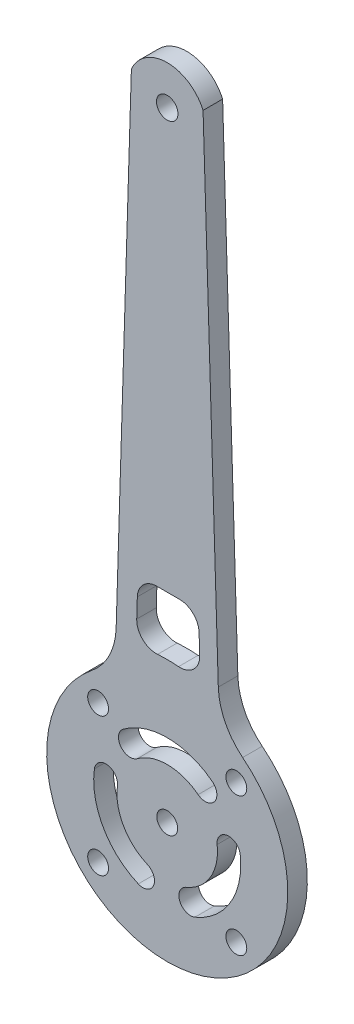
ISO-10303-21;
HEADER;
FILE_DESCRIPTION(('STEP AP214'),'2;1');
FILE_NAME('part.step','',(''),(''),'','','');
FILE_SCHEMA(('AUTOMOTIVE_DESIGN { 1 0 10303 214 1 1 1 1 }'));
ENDSEC;
DATA;
#1=APPLICATION_CONTEXT('core data for automotive mechanical design processes');
#2=APPLICATION_PROTOCOL_DEFINITION('international standard','automotive_design',2000,#1);
#3=PRODUCT_CONTEXT('',#1,'mechanical');
#4=PRODUCT('Part','Part','',(#3));
#5=PRODUCT_RELATED_PRODUCT_CATEGORY('part','',(#4));
#6=PRODUCT_DEFINITION_FORMATION('','',#4);
#7=PRODUCT_DEFINITION_CONTEXT('part definition',#1,'design');
#8=PRODUCT_DEFINITION('design','',#6,#7);
#9=PRODUCT_DEFINITION_SHAPE('','',#8);
#10=(LENGTH_UNIT() NAMED_UNIT(*) SI_UNIT(.MILLI.,.METRE.));
#11=(NAMED_UNIT(*) PLANE_ANGLE_UNIT() SI_UNIT($,.RADIAN.));
#12=(NAMED_UNIT(*) SI_UNIT($,.STERADIAN.) SOLID_ANGLE_UNIT());
#13=UNCERTAINTY_MEASURE_WITH_UNIT(LENGTH_MEASURE(1.E-05),#10,'distance_accuracy_value','');
#14=(GEOMETRIC_REPRESENTATION_CONTEXT(3) GLOBAL_UNCERTAINTY_ASSIGNED_CONTEXT((#13)) GLOBAL_UNIT_ASSIGNED_CONTEXT((#10,
#11,#12)) REPRESENTATION_CONTEXT('',''));
#15=CARTESIAN_POINT('',(0.,0.,0.));
#16=DIRECTION('',(0.,0.,1.));
#17=DIRECTION('',(1.,0.,0.));
#18=AXIS2_PLACEMENT_3D('',#15,#16,#17);
#19=CARTESIAN_POINT('',(0.,0.,3.));
#20=DIRECTION('',(0.,0.,1.));
#21=DIRECTION('',(1.,0.,0.));
#22=AXIS2_PLACEMENT_3D('',#19,#20,#21);
#23=PLANE('',#22);
#24=CARTESIAN_POINT('',(-10.6066017177982,-105.606601717798,3.));
#25=DIRECTION('',(0.,0.,1.));
#26=DIRECTION('',(1.,0.,0.));
#27=AXIS2_PLACEMENT_3D('',#24,#25,#26);
#28=CIRCLE('',#27,1.59999999999996);
#29=CARTESIAN_POINT('',(-9.00660171779825,-105.606601717798,3.));
#30=VERTEX_POINT('',#29);
#31=EDGE_CURVE('E325',#30,#30,#28,.T.);
#32=ORIENTED_EDGE('',*,*,#31,.F.);
#33=EDGE_LOOP('',(#32));
#34=FACE_BOUND('',#33,.T.);
#35=CARTESIAN_POINT('',(10.6066017177982,-84.3933982822018,3.));
#36=DIRECTION('',(0.,0.,1.));
#37=DIRECTION('',(1.,0.,0.));
#38=AXIS2_PLACEMENT_3D('',#35,#36,#37);
#39=CIRCLE('',#38,1.59999999999998);
#40=CARTESIAN_POINT('',(12.2066017177982,-84.3933982822018,3.));
#41=VERTEX_POINT('',#40);
#42=EDGE_CURVE('E341',#41,#41,#39,.T.);
#43=ORIENTED_EDGE('',*,*,#42,.F.);
#44=EDGE_LOOP('',(#43));
#45=FACE_BOUND('',#44,.T.);
#46=CARTESIAN_POINT('',(0.,-95.,3.));
#47=DIRECTION('',(0.,0.,1.));
#48=DIRECTION('',(1.,0.,0.));
#49=AXIS2_PLACEMENT_3D('',#46,#47,#48);
#50=CIRCLE('',#49,11.2845562791883);
#51=CARTESIAN_POINT('',(6.9331029947572,-86.0964449076642,3.));
#52=VERTEX_POINT('',#51);
#53=CARTESIAN_POINT('',(-6.76200290879406,-85.9658134245728,3.));
#54=VERTEX_POINT('',#53);
#55=EDGE_CURVE('E391',#52,#54,#50,.T.);
#56=ORIENTED_EDGE('',*,*,#55,.F.);
#57=CARTESIAN_POINT('',(5.83669191952763,-87.504466167342,3.));
#58=DIRECTION('',(0.,0.,1.));
#59=DIRECTION('',(1.,0.,0.));
#60=AXIS2_PLACEMENT_3D('',#57,#58,#59);
#61=CIRCLE('',#60,1.78455627918834);
#62=CARTESIAN_POINT('',(4.74028084429807,-88.9124874270197,3.));
#63=VERTEX_POINT('',#62);
#64=EDGE_CURVE('E388',#63,#52,#61,.T.);
#65=ORIENTED_EDGE('',*,*,#64,.F.);
#66=CARTESIAN_POINT('',(0.,-95.,3.));
#67=DIRECTION('',(0.,0.,-1.));
#68=DIRECTION('',(1.,0.,0.));
#69=AXIS2_PLACEMENT_3D('',#66,#67,#68);
#70=CIRCLE('',#69,7.71544372081166);
#71=CARTESIAN_POINT('',(-4.6232967953719,-88.8231724525517,3.));
#72=VERTEX_POINT('',#71);
#73=EDGE_CURVE('E399',#72,#63,#70,.T.);
#74=ORIENTED_EDGE('',*,*,#73,.F.);
#75=CARTESIAN_POINT('',(-5.69264985208298,-87.3944929385623,3.));
#76=DIRECTION('',(0.,0.,1.));
#77=DIRECTION('',(1.,0.,0.));
#78=AXIS2_PLACEMENT_3D('',#75,#76,#77);
#79=CIRCLE('',#78,1.78455627918834);
#80=EDGE_CURVE('E395',#54,#72,#79,.T.);
#81=ORIENTED_EDGE('',*,*,#80,.F.);
#82=EDGE_LOOP('',(#56,#65,#74,#81));
#83=FACE_BOUND('',#82,.T.);
#84=CARTESIAN_POINT('',(0.,0.,3.));
#85=DIRECTION('',(0.,0.,1.));
#86=DIRECTION('',(1.,0.,0.));
#87=AXIS2_PLACEMENT_3D('',#84,#85,#86);
#88=CIRCLE('',#87,1.65);
#89=CARTESIAN_POINT('',(1.65,0.,3.));
#90=VERTEX_POINT('',#89);
#91=EDGE_CURVE('E431',#90,#90,#88,.T.);
#92=ORIENTED_EDGE('',*,*,#91,.F.);
#93=EDGE_LOOP('',(#92));
#94=FACE_BOUND('',#93,.T.);
#95=CARTESIAN_POINT('',(0.,0.,3.));
#96=DIRECTION('',(0.,0.,1.));
#97=DIRECTION('',(1.,0.,0.));
#98=AXIS2_PLACEMENT_3D('',#95,#96,#97);
#99=CIRCLE('',#98,6.);
#100=CARTESIAN_POINT('',(5.5,2.39791576165636,3.));
#101=VERTEX_POINT('',#100);
#102=CARTESIAN_POINT('',(-5.5,2.39791576165636,3.));
#103=VERTEX_POINT('',#102);
#104=EDGE_CURVE('E439',#101,#103,#99,.T.);
#105=ORIENTED_EDGE('',*,*,#104,.T.);
#106=DIRECTION('',(-0.0309575308044056,-0.999520700779376,0.));
#107=VECTOR('',#106,1.);
#108=CARTESIAN_POINT('',(-5.5,2.39791576165636,3.));
#109=LINE('',#108,#107);
#110=CARTESIAN_POINT('',(-7.83767156365856,-73.0781011811258,3.));
#111=VERTEX_POINT('',#110);
#112=EDGE_CURVE('E443',#103,#111,#109,.T.);
#113=ORIENTED_EDGE('',*,*,#112,.T.);
#114=CARTESIAN_POINT('',(-17.8328785714523,-72.7685258730817,3.));
#115=DIRECTION('',(0.,0.,1.));
#116=DIRECTION('',(1.,0.,0.));
#117=AXIS2_PLACEMENT_3D('',#114,#115,#116);
#118=CIRCLE('',#117,10.);
#119=CARTESIAN_POINT('',(-11.5757281955041,-80.5690431105969,3.));
#120=VERTEX_POINT('',#119);
#121=EDGE_CURVE('E499',#111,#120,#118,.F.);
#122=ORIENTED_EDGE('',*,*,#121,.T.);
#123=CARTESIAN_POINT('',(0.,-95.,3.));
#124=DIRECTION('',(0.,0.,1.));
#125=DIRECTION('',(1.,0.,0.));
#126=AXIS2_PLACEMENT_3D('',#123,#124,#125);
#127=CIRCLE('',#126,18.5);
#128=CARTESIAN_POINT('',(11.5757281955041,-80.5690431105969,3.));
#129=VERTEX_POINT('',#128);
#130=EDGE_CURVE('E448',#120,#129,#127,.T.);
#131=ORIENTED_EDGE('',*,*,#130,.T.);
#132=CARTESIAN_POINT('',(17.8328785714523,-72.7685258730817,3.));
#133=DIRECTION('',(0.,0.,1.));
#134=DIRECTION('',(1.,0.,0.));
#135=AXIS2_PLACEMENT_3D('',#132,#133,#134);
#136=CIRCLE('',#135,10.);
#137=CARTESIAN_POINT('',(7.83767156365858,-73.0781011811258,3.));
#138=VERTEX_POINT('',#137);
#139=EDGE_CURVE('E493',#129,#138,#136,.F.);
#140=ORIENTED_EDGE('',*,*,#139,.T.);
#141=DIRECTION('',(-0.0309575308044059,0.999520700779376,0.));
#142=VECTOR('',#141,1.);
#143=CARTESIAN_POINT('',(5.5,2.39791576165636,3.));
#144=LINE('',#143,#142);
#145=EDGE_CURVE('E452',#138,#101,#144,.T.);
#146=ORIENTED_EDGE('',*,*,#145,.T.);
#147=EDGE_LOOP('',(#105,#113,#122,#131,#140,#146));
#148=FACE_BOUND('',#147,.T.);
#149=CARTESIAN_POINT('',(0.,-95.,3.));
#150=DIRECTION('',(0.,0.,1.));
#151=DIRECTION('',(1.,0.,0.));
#152=AXIS2_PLACEMENT_3D('',#149,#150,#151);
#153=CIRCLE('',#152,1.6);
#154=CARTESIAN_POINT('',(1.60000000000001,-95.,3.));
#155=VERTEX_POINT('',#154);
#156=EDGE_CURVE('E380',#155,#155,#153,.T.);
#157=ORIENTED_EDGE('',*,*,#156,.F.);
#158=EDGE_LOOP('',(#157));
#159=FACE_BOUND('',#158,.T.);
#160=DIRECTION('',(-0.0309575308044059,0.999520700779376,0.));
#161=VECTOR('',#160,1.);
#162=CARTESIAN_POINT('',(4.79924243193898,-64.390563514514,3.));
#163=LINE('',#162,#161);
#164=CARTESIAN_POINT('',(4.98290412788455,-70.3204184566826,3.));
#165=VERTEX_POINT('',#164);
#166=CARTESIAN_POINT('',(4.88928307462154,-67.2976909221008,3.));
#167=VERTEX_POINT('',#166);
#168=EDGE_CURVE('E353',#165,#167,#163,.T.);
#169=ORIENTED_EDGE('',*,*,#168,.F.);
#170=CARTESIAN_POINT('',(1.98434202554642,-70.4132910490958,3.));
#171=DIRECTION('',(0.,0.,1.));
#172=DIRECTION('',(1.,0.,0.));
#173=AXIS2_PLACEMENT_3D('',#170,#171,#172);
#174=CIRCLE('',#173,3.);
#175=CARTESIAN_POINT('',(1.74300301668268,-73.4035678728699,3.));
#176=VERTEX_POINT('',#175);
#177=EDGE_CURVE('E532',#165,#176,#174,.F.);
#178=ORIENTED_EDGE('',*,*,#177,.T.);
#179=CARTESIAN_POINT('',(0.,-95.,3.));
#180=DIRECTION('',(0.,0.,-1.));
#181=DIRECTION('',(1.,0.,0.));
#182=AXIS2_PLACEMENT_3D('',#179,#180,#181);
#183=CIRCLE('',#182,21.6666550288202);
#184=CARTESIAN_POINT('',(-1.47866051582502,-73.3838601221948,3.));
#185=VERTEX_POINT('',#184);
#186=EDGE_CURVE('E349',#185,#176,#183,.T.);
#187=ORIENTED_EDGE('',*,*,#186,.F.);
#188=CARTESIAN_POINT('',(-1.68339823567954,-70.3908545314769,3.));
#189=DIRECTION('',(0.,0.,1.));
#190=DIRECTION('',(1.,0.,0.));
#191=AXIS2_PLACEMENT_3D('',#188,#189,#190);
#192=CIRCLE('',#191,3.);
#193=CARTESIAN_POINT('',(-4.68196033801766,-70.2979819390637,3.));
#194=VERTEX_POINT('',#193);
#195=EDGE_CURVE('E538',#185,#194,#192,.F.);
#196=ORIENTED_EDGE('',*,*,#195,.T.);
#197=DIRECTION('',(-0.0309575308044057,-0.999520700779376,0.));
#198=VECTOR('',#197,1.);
#199=CARTESIAN_POINT('',(-4.49899355432833,-64.390563514514,3.));
#200=LINE('',#199,#198);
#201=CARTESIAN_POINT('',(-4.58903419701089,-67.2976909221008,3.));
#202=VERTEX_POINT('',#201);
#203=EDGE_CURVE('E361',#202,#194,#200,.T.);
#204=ORIENTED_EDGE('',*,*,#203,.F.);
#205=CARTESIAN_POINT('',(-1.59047209467277,-67.390563514514,3.));
#206=DIRECTION('',(0.,0.,1.));
#207=DIRECTION('',(1.,0.,0.));
#208=AXIS2_PLACEMENT_3D('',#205,#206,#207);
#209=CIRCLE('',#208,3.);
#210=CARTESIAN_POINT('',(-1.59047209467277,-64.390563514514,3.));
#211=VERTEX_POINT('',#210);
#212=EDGE_CURVE('E61',#202,#211,#209,.F.);
#213=ORIENTED_EDGE('',*,*,#212,.T.);
#214=DIRECTION('',(-1.,0.,0.));
#215=VECTOR('',#214,1.);
#216=CARTESIAN_POINT('',(-4.49899355432833,-64.390563514514,3.));
#217=LINE('',#216,#215);
#218=CARTESIAN_POINT('',(1.89072097228341,-64.390563514514,3.));
#219=VERTEX_POINT('',#218);
#220=EDGE_CURVE('E358',#219,#211,#217,.T.);
#221=ORIENTED_EDGE('',*,*,#220,.F.);
#222=CARTESIAN_POINT('',(1.89072097228341,-67.390563514514,3.));
#223=DIRECTION('',(0.,0.,1.));
#224=DIRECTION('',(1.,0.,0.));
#225=AXIS2_PLACEMENT_3D('',#222,#223,#224);
#226=CIRCLE('',#225,3.);
#227=EDGE_CURVE('E11',#219,#167,#226,.F.);
#228=ORIENTED_EDGE('',*,*,#227,.T.);
#229=EDGE_LOOP('',(#169,#178,#187,#196,#204,#213,#221,#228));
#230=FACE_BOUND('',#229,.T.);
#231=CARTESIAN_POINT('',(10.6066017177982,-105.606601717798,3.));
#232=DIRECTION('',(0.,0.,1.));
#233=DIRECTION('',(1.,0.,0.));
#234=AXIS2_PLACEMENT_3D('',#231,#232,#233);
#235=CIRCLE('',#234,1.6);
#236=CARTESIAN_POINT('',(12.2066017177982,-105.606601717798,3.));
#237=VERTEX_POINT('',#236);
#238=EDGE_CURVE('E333',#237,#237,#235,.T.);
#239=ORIENTED_EDGE('',*,*,#238,.F.);
#240=EDGE_LOOP('',(#239));
#241=FACE_BOUND('',#240,.T.);
#242=CARTESIAN_POINT('',(-10.6066017177982,-84.3933982822018,3.));
#243=DIRECTION('',(0.,0.,1.));
#244=DIRECTION('',(1.,0.,0.));
#245=AXIS2_PLACEMENT_3D('',#242,#243,#244);
#246=CIRCLE('',#245,1.60000000000002);
#247=CARTESIAN_POINT('',(-9.00660171779818,-84.3933982822018,3.));
#248=VERTEX_POINT('',#247);
#249=EDGE_CURVE('E317',#248,#248,#246,.T.);
#250=ORIENTED_EDGE('',*,*,#249,.F.);
#251=EDGE_LOOP('',(#250));
#252=FACE_BOUND('',#251,.T.);
#253=CARTESIAN_POINT('',(0.,-95.,3.));
#254=DIRECTION('',(0.,0.,1.));
#255=DIRECTION('',(1.,0.,0.));
#256=AXIS2_PLACEMENT_3D('',#253,#254,#255);
#257=CIRCLE('',#256,11.2845562791883);
#258=CARTESIAN_POINT('',(4.24415339657849,-105.456020866682,3.));
#259=VERTEX_POINT('',#258);
#260=CARTESIAN_POINT('',(11.2048365312454,-93.6610269882337,3.));
#261=VERTEX_POINT('',#260);
#262=EDGE_CURVE('E277',#259,#261,#257,.T.);
#263=ORIENTED_EDGE('',*,*,#262,.F.);
#264=CARTESIAN_POINT('',(3.57297675424379,-103.802490392703,3.));
#265=DIRECTION('',(0.,0.,1.));
#266=DIRECTION('',(1.,0.,0.));
#267=AXIS2_PLACEMENT_3D('',#264,#265,#266);
#268=CIRCLE('',#267,1.78455627918834);
#269=CARTESIAN_POINT('',(2.90180011190907,-102.148959918725,3.));
#270=VERTEX_POINT('',#269);
#271=EDGE_CURVE('E274',#270,#259,#268,.T.);
#272=ORIENTED_EDGE('',*,*,#271,.F.);
#273=CARTESIAN_POINT('',(0.,-95.,3.));
#274=DIRECTION('',(0.,0.,-1.));
#275=DIRECTION('',(1.,0.,0.));
#276=AXIS2_PLACEMENT_3D('',#273,#274,#275);
#277=CIRCLE('',#276,7.71544372081166);
#278=CARTESIAN_POINT('',(7.66093796857171,-94.0845212996969,3.));
#279=VERTEX_POINT('',#278);
#280=EDGE_CURVE('E285',#279,#270,#277,.T.);
#281=ORIENTED_EDGE('',*,*,#280,.F.);
#282=CARTESIAN_POINT('',(9.43288724990854,-93.8727741439653,3.));
#283=DIRECTION('',(0.,0.,1.));
#284=DIRECTION('',(1.,0.,0.));
#285=AXIS2_PLACEMENT_3D('',#282,#283,#284);
#286=CIRCLE('',#285,1.78455627918834);
#287=EDGE_CURVE('E281',#261,#279,#286,.T.);
#288=ORIENTED_EDGE('',*,*,#287,.F.);
#289=EDGE_LOOP('',(#263,#272,#281,#288));
#290=FACE_BOUND('',#289,.T.);
#291=CARTESIAN_POINT('',(0.,-95.,3.));
#292=DIRECTION('',(0.,0.,1.));
#293=DIRECTION('',(1.,0.,0.));
#294=AXIS2_PLACEMENT_3D('',#291,#292,#293);
#295=CIRCLE('',#294,11.2845562791883);
#296=CARTESIAN_POINT('',(-11.1772563913356,-93.4475342256542,3.));
#297=VERTEX_POINT('',#296);
#298=CARTESIAN_POINT('',(-4.44283362245129,-105.373159587194,3.));
#299=VERTEX_POINT('',#298);
#300=EDGE_CURVE('E232',#297,#299,#295,.T.);
#301=ORIENTED_EDGE('',*,*,#300,.F.);
#302=CARTESIAN_POINT('',(-9.40966867377141,-93.6930434399547,3.));
#303=DIRECTION('',(0.,0.,1.));
#304=DIRECTION('',(1.,0.,0.));
#305=AXIS2_PLACEMENT_3D('',#302,#303,#304);
#306=CIRCLE('',#305,1.78455627918834);
#307=CARTESIAN_POINT('',(-7.64208095620712,-93.9385526542553,3.));
#308=VERTEX_POINT('',#307);
#309=EDGE_CURVE('E221',#308,#297,#306,.T.);
#310=ORIENTED_EDGE('',*,*,#309,.F.);
#311=CARTESIAN_POINT('',(0.,-95.,3.));
#312=DIRECTION('',(0.,0.,-1.));
#313=DIRECTION('',(1.,0.,0.));
#314=AXIS2_PLACEMENT_3D('',#311,#312,#313);
#315=CIRCLE('',#314,7.71544372081167);
#316=CARTESIAN_POINT('',(-3.03764117319978,-102.092306247751,3.));
#317=VERTEX_POINT('',#316);
#318=EDGE_CURVE('E250',#317,#308,#315,.T.);
#319=ORIENTED_EDGE('',*,*,#318,.F.);
#320=CARTESIAN_POINT('',(-3.74023739782553,-103.732732917472,3.));
#321=DIRECTION('',(0.,0.,1.));
#322=DIRECTION('',(1.,0.,0.));
#323=AXIS2_PLACEMENT_3D('',#320,#321,#322);
#324=CIRCLE('',#323,1.78455627918833);
#325=EDGE_CURVE('E246',#299,#317,#324,.T.);
#326=ORIENTED_EDGE('',*,*,#325,.F.);
#327=EDGE_LOOP('',(#301,#310,#319,#326));
#328=FACE_BOUND('',#327,.T.);
#329=ADVANCED_FACE('F45',(#34,#45,#83,#94,#148,#159,#230,#241,#252,#290,#328),#23,.T.);
#330=CARTESIAN_POINT('',(0.,0.,0.));
#331=DIRECTION('',(0.,0.,1.));
#332=DIRECTION('',(1.,0.,0.));
#333=AXIS2_PLACEMENT_3D('',#330,#331,#332);
#334=PLANE('',#333);
#335=CARTESIAN_POINT('',(3.57297675424379,-103.802490392703,0.));
#336=DIRECTION('',(0.,0.,1.));
#337=DIRECTION('',(1.,0.,0.));
#338=AXIS2_PLACEMENT_3D('',#335,#336,#337);
#339=CIRCLE('',#338,1.78455627918834);
#340=CARTESIAN_POINT('',(2.90180011190907,-102.148959918725,0.));
#341=VERTEX_POINT('',#340);
#342=CARTESIAN_POINT('',(4.24415339657849,-105.456020866682,0.));
#343=VERTEX_POINT('',#342);
#344=EDGE_CURVE('E241',#341,#343,#339,.T.);
#345=ORIENTED_EDGE('',*,*,#344,.T.);
#346=CARTESIAN_POINT('',(0.,-95.,0.));
#347=DIRECTION('',(0.,0.,1.));
#348=DIRECTION('',(1.,0.,0.));
#349=AXIS2_PLACEMENT_3D('',#346,#347,#348);
#350=CIRCLE('',#349,11.2845562791883);
#351=CARTESIAN_POINT('',(11.2048365312454,-93.6610269882337,0.));
#352=VERTEX_POINT('',#351);
#353=EDGE_CURVE('E292',#343,#352,#350,.T.);
#354=ORIENTED_EDGE('',*,*,#353,.T.);
#355=CARTESIAN_POINT('',(9.43288724990854,-93.8727741439653,0.));
#356=DIRECTION('',(0.,0.,1.));
#357=DIRECTION('',(1.,0.,0.));
#358=AXIS2_PLACEMENT_3D('',#355,#356,#357);
#359=CIRCLE('',#358,1.78455627918834);
#360=CARTESIAN_POINT('',(7.66093796857171,-94.0845212996969,0.));
#361=VERTEX_POINT('',#360);
#362=EDGE_CURVE('E296',#352,#361,#359,.T.);
#363=ORIENTED_EDGE('',*,*,#362,.T.);
#364=CARTESIAN_POINT('',(0.,-95.,0.));
#365=DIRECTION('',(0.,0.,-1.));
#366=DIRECTION('',(1.,0.,0.));
#367=AXIS2_PLACEMENT_3D('',#364,#365,#366);
#368=CIRCLE('',#367,7.71544372081166);
#369=EDGE_CURVE('E278',#361,#341,#368,.T.);
#370=ORIENTED_EDGE('',*,*,#369,.T.);
#371=EDGE_LOOP('',(#345,#354,#363,#370));
#372=FACE_BOUND('',#371,.T.);
#373=CARTESIAN_POINT('',(0.,-95.,0.));
#374=DIRECTION('',(0.,0.,1.));
#375=DIRECTION('',(1.,0.,0.));
#376=AXIS2_PLACEMENT_3D('',#373,#374,#375);
#377=CIRCLE('',#376,1.6);
#378=CARTESIAN_POINT('',(1.60000000000001,-95.,0.));
#379=VERTEX_POINT('',#378);
#380=EDGE_CURVE('E365',#379,#379,#377,.T.);
#381=ORIENTED_EDGE('',*,*,#380,.T.);
#382=EDGE_LOOP('',(#381));
#383=FACE_BOUND('',#382,.T.);
#384=CARTESIAN_POINT('',(5.83669191952763,-87.504466167342,0.));
#385=DIRECTION('',(0.,0.,1.));
#386=DIRECTION('',(1.,0.,0.));
#387=AXIS2_PLACEMENT_3D('',#384,#385,#386);
#388=CIRCLE('',#387,1.78455627918834);
#389=CARTESIAN_POINT('',(4.74028084429807,-88.9124874270197,0.));
#390=VERTEX_POINT('',#389);
#391=CARTESIAN_POINT('',(6.9331029947572,-86.0964449076642,0.));
#392=VERTEX_POINT('',#391);
#393=EDGE_CURVE('E384',#390,#392,#388,.T.);
#394=ORIENTED_EDGE('',*,*,#393,.T.);
#395=CARTESIAN_POINT('',(0.,-95.,0.));
#396=DIRECTION('',(0.,0.,1.));
#397=DIRECTION('',(1.,0.,0.));
#398=AXIS2_PLACEMENT_3D('',#395,#396,#397);
#399=CIRCLE('',#398,11.2845562791883);
#400=CARTESIAN_POINT('',(-6.76200290879406,-85.9658134245728,0.));
#401=VERTEX_POINT('',#400);
#402=EDGE_CURVE('E406',#392,#401,#399,.T.);
#403=ORIENTED_EDGE('',*,*,#402,.T.);
#404=CARTESIAN_POINT('',(-5.69264985208298,-87.3944929385623,0.));
#405=DIRECTION('',(0.,0.,1.));
#406=DIRECTION('',(1.,0.,0.));
#407=AXIS2_PLACEMENT_3D('',#404,#405,#406);
#408=CIRCLE('',#407,1.78455627918834);
#409=CARTESIAN_POINT('',(-4.6232967953719,-88.8231724525517,0.));
#410=VERTEX_POINT('',#409);
#411=EDGE_CURVE('E410',#401,#410,#408,.T.);
#412=ORIENTED_EDGE('',*,*,#411,.T.);
#413=CARTESIAN_POINT('',(0.,-95.,0.));
#414=DIRECTION('',(0.,0.,-1.));
#415=DIRECTION('',(1.,0.,0.));
#416=AXIS2_PLACEMENT_3D('',#413,#414,#415);
#417=CIRCLE('',#416,7.71544372081166);
#418=EDGE_CURVE('E392',#410,#390,#417,.T.);
#419=ORIENTED_EDGE('',*,*,#418,.T.);
#420=EDGE_LOOP('',(#394,#403,#412,#419));
#421=FACE_BOUND('',#420,.T.);
#422=CARTESIAN_POINT('',(0.,0.,0.));
#423=DIRECTION('',(0.,0.,1.));
#424=DIRECTION('',(1.,0.,0.));
#425=AXIS2_PLACEMENT_3D('',#422,#423,#424);
#426=CIRCLE('',#425,6.);
#427=CARTESIAN_POINT('',(5.5,2.39791576165636,0.));
#428=VERTEX_POINT('',#427);
#429=CARTESIAN_POINT('',(-5.5,2.39791576165636,0.));
#430=VERTEX_POINT('',#429);
#431=EDGE_CURVE('E435',#428,#430,#426,.T.);
#432=ORIENTED_EDGE('',*,*,#431,.F.);
#433=DIRECTION('',(-0.0309575308044059,0.999520700779376,0.));
#434=VECTOR('',#433,1.);
#435=CARTESIAN_POINT('',(5.5,2.39791576165636,0.));
#436=LINE('',#435,#434);
#437=CARTESIAN_POINT('',(7.83767156365858,-73.0781011811258,0.));
#438=VERTEX_POINT('',#437);
#439=EDGE_CURVE('E444',#438,#428,#436,.T.);
#440=ORIENTED_EDGE('',*,*,#439,.F.);
#441=CARTESIAN_POINT('',(17.8328785714523,-72.7685258730817,0.));
#442=DIRECTION('',(0.,0.,1.));
#443=DIRECTION('',(1.,0.,0.));
#444=AXIS2_PLACEMENT_3D('',#441,#442,#443);
#445=CIRCLE('',#444,10.);
#446=CARTESIAN_POINT('',(11.5757281955041,-80.5690431105969,0.));
#447=VERTEX_POINT('',#446);
#448=EDGE_CURVE('E490',#438,#447,#445,.T.);
#449=ORIENTED_EDGE('',*,*,#448,.T.);
#450=CARTESIAN_POINT('',(0.,-95.,0.));
#451=DIRECTION('',(0.,0.,1.));
#452=DIRECTION('',(1.,0.,0.));
#453=AXIS2_PLACEMENT_3D('',#450,#451,#452);
#454=CIRCLE('',#453,18.5);
#455=CARTESIAN_POINT('',(-11.5757281955041,-80.5690431105969,0.));
#456=VERTEX_POINT('',#455);
#457=EDGE_CURVE('E463',#456,#447,#454,.T.);
#458=ORIENTED_EDGE('',*,*,#457,.F.);
#459=CARTESIAN_POINT('',(-17.8328785714523,-72.7685258730817,0.));
#460=DIRECTION('',(0.,0.,1.));
#461=DIRECTION('',(1.,0.,0.));
#462=AXIS2_PLACEMENT_3D('',#459,#460,#461);
#463=CIRCLE('',#462,10.);
#464=CARTESIAN_POINT('',(-7.83767156365856,-73.0781011811258,0.));
#465=VERTEX_POINT('',#464);
#466=EDGE_CURVE('E496',#456,#465,#463,.T.);
#467=ORIENTED_EDGE('',*,*,#466,.T.);
#468=DIRECTION('',(-0.0309575308044056,-0.999520700779376,0.));
#469=VECTOR('',#468,1.);
#470=CARTESIAN_POINT('',(-5.5,2.39791576165636,0.));
#471=LINE('',#470,#469);
#472=EDGE_CURVE('E459',#430,#465,#471,.T.);
#473=ORIENTED_EDGE('',*,*,#472,.F.);
#474=EDGE_LOOP('',(#432,#440,#449,#458,#467,#473));
#475=FACE_BOUND('',#474,.T.);
#476=CARTESIAN_POINT('',(0.,0.,0.));
#477=DIRECTION('',(0.,0.,1.));
#478=DIRECTION('',(1.,0.,0.));
#479=AXIS2_PLACEMENT_3D('',#476,#477,#478);
#480=CIRCLE('',#479,1.65);
#481=CARTESIAN_POINT('',(1.65,0.,0.));
#482=VERTEX_POINT('',#481);
#483=EDGE_CURVE('E430',#482,#482,#480,.T.);
#484=ORIENTED_EDGE('',*,*,#483,.T.);
#485=EDGE_LOOP('',(#484));
#486=FACE_BOUND('',#485,.T.);
#487=DIRECTION('',(-0.0309575308044057,-0.999520700779376,0.));
#488=VECTOR('',#487,1.);
#489=CARTESIAN_POINT('',(-4.49899355432833,-64.390563514514,0.));
#490=LINE('',#489,#488);
#491=CARTESIAN_POINT('',(-4.58903419701089,-67.2976909221008,0.));
#492=VERTEX_POINT('',#491);
#493=CARTESIAN_POINT('',(-4.68196033801766,-70.2979819390637,0.));
#494=VERTEX_POINT('',#493);
#495=EDGE_CURVE('E354',#492,#494,#490,.T.);
#496=ORIENTED_EDGE('',*,*,#495,.T.);
#497=CARTESIAN_POINT('',(-1.68339823567954,-70.3908545314769,0.));
#498=DIRECTION('',(0.,0.,1.));
#499=DIRECTION('',(1.,0.,0.));
#500=AXIS2_PLACEMENT_3D('',#497,#498,#499);
#501=CIRCLE('',#500,3.);
#502=CARTESIAN_POINT('',(-1.47866051582502,-73.3838601221948,0.));
#503=VERTEX_POINT('',#502);
#504=EDGE_CURVE('E535',#494,#503,#501,.T.);
#505=ORIENTED_EDGE('',*,*,#504,.T.);
#506=CARTESIAN_POINT('',(0.,-95.,0.));
#507=DIRECTION('',(0.,0.,-1.));
#508=DIRECTION('',(1.,0.,0.));
#509=AXIS2_PLACEMENT_3D('',#506,#507,#508);
#510=CIRCLE('',#509,21.6666550288202);
#511=CARTESIAN_POINT('',(1.74300301668268,-73.4035678728699,0.));
#512=VERTEX_POINT('',#511);
#513=EDGE_CURVE('E345',#503,#512,#510,.T.);
#514=ORIENTED_EDGE('',*,*,#513,.T.);
#515=CARTESIAN_POINT('',(1.98434202554642,-70.4132910490958,0.));
#516=DIRECTION('',(0.,0.,1.));
#517=DIRECTION('',(1.,0.,0.));
#518=AXIS2_PLACEMENT_3D('',#515,#516,#517);
#519=CIRCLE('',#518,3.);
#520=CARTESIAN_POINT('',(4.98290412788455,-70.3204184566826,0.));
#521=VERTEX_POINT('',#520);
#522=EDGE_CURVE('E529',#512,#521,#519,.T.);
#523=ORIENTED_EDGE('',*,*,#522,.T.);
#524=DIRECTION('',(-0.0309575308044059,0.999520700779376,0.));
#525=VECTOR('',#524,1.);
#526=CARTESIAN_POINT('',(4.79924243193898,-64.390563514514,0.));
#527=LINE('',#526,#525);
#528=CARTESIAN_POINT('',(4.88928307462154,-67.2976909221008,0.));
#529=VERTEX_POINT('',#528);
#530=EDGE_CURVE('E369',#521,#529,#527,.T.);
#531=ORIENTED_EDGE('',*,*,#530,.T.);
#532=CARTESIAN_POINT('',(1.89072097228341,-67.390563514514,0.));
#533=DIRECTION('',(0.,0.,1.));
#534=DIRECTION('',(1.,0.,0.));
#535=AXIS2_PLACEMENT_3D('',#532,#533,#534);
#536=CIRCLE('',#535,3.);
#537=CARTESIAN_POINT('',(1.89072097228341,-64.390563514514,0.));
#538=VERTEX_POINT('',#537);
#539=EDGE_CURVE('E54',#529,#538,#536,.T.);
#540=ORIENTED_EDGE('',*,*,#539,.T.);
#541=DIRECTION('',(-1.,0.,0.));
#542=VECTOR('',#541,1.);
#543=CARTESIAN_POINT('',(-4.49899355432833,-64.390563514514,0.));
#544=LINE('',#543,#542);
#545=CARTESIAN_POINT('',(-1.59047209467277,-64.390563514514,0.));
#546=VERTEX_POINT('',#545);
#547=EDGE_CURVE('E373',#538,#546,#544,.T.);
#548=ORIENTED_EDGE('',*,*,#547,.T.);
#549=CARTESIAN_POINT('',(-1.59047209467277,-67.390563514514,0.));
#550=DIRECTION('',(0.,0.,1.));
#551=DIRECTION('',(1.,0.,0.));
#552=AXIS2_PLACEMENT_3D('',#549,#550,#551);
#553=CIRCLE('',#552,3.);
#554=EDGE_CURVE('E541',#546,#492,#553,.T.);
#555=ORIENTED_EDGE('',*,*,#554,.T.);
#556=EDGE_LOOP('',(#496,#505,#514,#523,#531,#540,#548,#555));
#557=FACE_BOUND('',#556,.T.);
#558=CARTESIAN_POINT('',(10.6066017177982,-84.3933982822018,0.));
#559=DIRECTION('',(0.,0.,1.));
#560=DIRECTION('',(1.,0.,0.));
#561=AXIS2_PLACEMENT_3D('',#558,#559,#560);
#562=CIRCLE('',#561,1.59999999999998);
#563=CARTESIAN_POINT('',(12.2066017177982,-84.3933982822018,0.));
#564=VERTEX_POINT('',#563);
#565=EDGE_CURVE('E337',#564,#564,#562,.T.);
#566=ORIENTED_EDGE('',*,*,#565,.T.);
#567=EDGE_LOOP('',(#566));
#568=FACE_BOUND('',#567,.T.);
#569=CARTESIAN_POINT('',(10.6066017177982,-105.606601717798,0.));
#570=DIRECTION('',(0.,0.,1.));
#571=DIRECTION('',(1.,0.,0.));
#572=AXIS2_PLACEMENT_3D('',#569,#570,#571);
#573=CIRCLE('',#572,1.6);
#574=CARTESIAN_POINT('',(12.2066017177982,-105.606601717798,0.));
#575=VERTEX_POINT('',#574);
#576=EDGE_CURVE('E329',#575,#575,#573,.T.);
#577=ORIENTED_EDGE('',*,*,#576,.T.);
#578=EDGE_LOOP('',(#577));
#579=FACE_BOUND('',#578,.T.);
#580=CARTESIAN_POINT('',(-10.6066017177982,-105.606601717798,0.));
#581=DIRECTION('',(0.,0.,1.));
#582=DIRECTION('',(1.,0.,0.));
#583=AXIS2_PLACEMENT_3D('',#580,#581,#582);
#584=CIRCLE('',#583,1.59999999999996);
#585=CARTESIAN_POINT('',(-9.00660171779825,-105.606601717798,0.));
#586=VERTEX_POINT('',#585);
#587=EDGE_CURVE('E321',#586,#586,#584,.T.);
#588=ORIENTED_EDGE('',*,*,#587,.T.);
#589=EDGE_LOOP('',(#588));
#590=FACE_BOUND('',#589,.T.);
#591=CARTESIAN_POINT('',(-10.6066017177982,-84.3933982822018,0.));
#592=DIRECTION('',(0.,0.,1.));
#593=DIRECTION('',(1.,0.,0.));
#594=AXIS2_PLACEMENT_3D('',#591,#592,#593);
#595=CIRCLE('',#594,1.60000000000002);
#596=CARTESIAN_POINT('',(-9.00660171779818,-84.3933982822018,0.));
#597=VERTEX_POINT('',#596);
#598=EDGE_CURVE('E316',#597,#597,#595,.T.);
#599=ORIENTED_EDGE('',*,*,#598,.T.);
#600=EDGE_LOOP('',(#599));
#601=FACE_BOUND('',#600,.T.);
#602=CARTESIAN_POINT('',(-9.40966867377141,-93.6930434399547,0.));
#603=DIRECTION('',(0.,0.,1.));
#604=DIRECTION('',(1.,0.,0.));
#605=AXIS2_PLACEMENT_3D('',#602,#603,#604);
#606=CIRCLE('',#605,1.78455627918834);
#607=CARTESIAN_POINT('',(-7.64208095620712,-93.9385526542553,0.));
#608=VERTEX_POINT('',#607);
#609=CARTESIAN_POINT('',(-11.1772563913356,-93.4475342256542,0.));
#610=VERTEX_POINT('',#609);
#611=EDGE_CURVE('E255',#608,#610,#606,.T.);
#612=ORIENTED_EDGE('',*,*,#611,.T.);
#613=CARTESIAN_POINT('',(0.,-95.,0.));
#614=DIRECTION('',(0.,0.,1.));
#615=DIRECTION('',(1.,0.,0.));
#616=AXIS2_PLACEMENT_3D('',#613,#614,#615);
#617=CIRCLE('',#616,11.2845562791883);
#618=CARTESIAN_POINT('',(-4.44283362245129,-105.373159587194,0.));
#619=VERTEX_POINT('',#618);
#620=EDGE_CURVE('E239',#610,#619,#617,.T.);
#621=ORIENTED_EDGE('',*,*,#620,.T.);
#622=CARTESIAN_POINT('',(-3.74023739782553,-103.732732917472,0.));
#623=DIRECTION('',(0.,0.,1.));
#624=DIRECTION('',(1.,0.,0.));
#625=AXIS2_PLACEMENT_3D('',#622,#623,#624);
#626=CIRCLE('',#625,1.78455627918833);
#627=CARTESIAN_POINT('',(-3.03764117319978,-102.092306247751,0.));
#628=VERTEX_POINT('',#627);
#629=EDGE_CURVE('E260',#619,#628,#626,.T.);
#630=ORIENTED_EDGE('',*,*,#629,.T.);
#631=CARTESIAN_POINT('',(0.,-95.,0.));
#632=DIRECTION('',(0.,0.,-1.));
#633=DIRECTION('',(1.,0.,0.));
#634=AXIS2_PLACEMENT_3D('',#631,#632,#633);
#635=CIRCLE('',#634,7.71544372081167);
#636=EDGE_CURVE('E233',#628,#608,#635,.T.);
#637=ORIENTED_EDGE('',*,*,#636,.T.);
#638=EDGE_LOOP('',(#612,#621,#630,#637));
#639=FACE_BOUND('',#638,.T.);
#640=ADVANCED_FACE('F547',(#372,#383,#421,#475,#486,#557,#568,#579,#590,#601,#639),#334,.F.);
#641=CARTESIAN_POINT('',(0.,0.,3.));
#642=DIRECTION('',(0.,0.,-1.));
#643=DIRECTION('',(-1.,0.,0.));
#644=AXIS2_PLACEMENT_3D('',#641,#642,#643);
#645=CYLINDRICAL_SURFACE('',#644,6.);
#646=ORIENTED_EDGE('',*,*,#431,.T.);
#647=DIRECTION('',(0.,0.,-1.));
#648=VECTOR('',#647,1.);
#649=CARTESIAN_POINT('',(-5.5,2.39791576165636,3.));
#650=LINE('',#649,#648);
#651=EDGE_CURVE('E472',#103,#430,#650,.T.);
#652=ORIENTED_EDGE('',*,*,#651,.F.);
#653=ORIENTED_EDGE('',*,*,#104,.F.);
#654=DIRECTION('',(0.,0.,-1.));
#655=VECTOR('',#654,1.);
#656=CARTESIAN_POINT('',(5.5,2.39791576165636,3.));
#657=LINE('',#656,#655);
#658=EDGE_CURVE('E455',#101,#428,#657,.T.);
#659=ORIENTED_EDGE('',*,*,#658,.T.);
#660=EDGE_LOOP('',(#646,#652,#653,#659));
#661=FACE_BOUND('',#660,.T.);
#662=ADVANCED_FACE('F592',(#661),#645,.T.);
#663=CARTESIAN_POINT('',(-5.5,2.39791576165636,3.));
#664=DIRECTION('',(0.999520700779376,-0.0309575308044056,0.));
#665=DIRECTION('',(0.0309575308044056,0.999520700779376,0.));
#666=AXIS2_PLACEMENT_3D('',#663,#664,#665);
#667=PLANE('',#666);
#668=ORIENTED_EDGE('',*,*,#472,.T.);
#669=DIRECTION('',(0.,0.,1.));
#670=VECTOR('',#669,1.);
#671=CARTESIAN_POINT('',(-7.83767156365856,-73.0781011811258,3.));
#672=LINE('',#671,#670);
#673=EDGE_CURVE('E487',#465,#111,#672,.T.);
#674=ORIENTED_EDGE('',*,*,#673,.T.);
#675=ORIENTED_EDGE('',*,*,#112,.F.);
#676=ORIENTED_EDGE('',*,*,#651,.T.);
#677=EDGE_LOOP('',(#668,#674,#675,#676));
#678=FACE_BOUND('',#677,.T.);
#679=ADVANCED_FACE('F608',(#678),#667,.F.);
#680=CARTESIAN_POINT('',(0.,-95.,3.));
#681=DIRECTION('',(0.,0.,-1.));
#682=DIRECTION('',(-1.,0.,0.));
#683=AXIS2_PLACEMENT_3D('',#680,#681,#682);
#684=CYLINDRICAL_SURFACE('',#683,18.5);
#685=ORIENTED_EDGE('',*,*,#457,.T.);
#686=DIRECTION('',(0.,0.,-1.));
#687=VECTOR('',#686,1.);
#688=CARTESIAN_POINT('',(11.5757281955041,-80.5690431105969,3.));
#689=LINE('',#688,#687);
#690=EDGE_CURVE('E484',#447,#129,#689,.F.);
#691=ORIENTED_EDGE('',*,*,#690,.T.);
#692=ORIENTED_EDGE('',*,*,#130,.F.);
#693=DIRECTION('',(0.,0.,-1.));
#694=VECTOR('',#693,1.);
#695=CARTESIAN_POINT('',(-11.5757281955041,-80.5690431105969,3.));
#696=LINE('',#695,#694);
#697=EDGE_CURVE('E480',#120,#456,#696,.T.);
#698=ORIENTED_EDGE('',*,*,#697,.T.);
#699=EDGE_LOOP('',(#685,#691,#692,#698));
#700=FACE_BOUND('',#699,.T.);
#701=ADVANCED_FACE('F604',(#700),#684,.T.);
#702=CARTESIAN_POINT('',(5.5,2.39791576165636,3.));
#703=DIRECTION('',(-0.999520700779376,-0.0309575308044059,0.));
#704=DIRECTION('',(0.0309575308044059,-0.999520700779376,0.));
#705=AXIS2_PLACEMENT_3D('',#702,#703,#704);
#706=PLANE('',#705);
#707=ORIENTED_EDGE('',*,*,#145,.F.);
#708=DIRECTION('',(0.,0.,1.));
#709=VECTOR('',#708,1.);
#710=CARTESIAN_POINT('',(7.83767156365858,-73.0781011811258,0.));
#711=LINE('',#710,#709);
#712=EDGE_CURVE('E476',#138,#438,#711,.F.);
#713=ORIENTED_EDGE('',*,*,#712,.T.);
#714=ORIENTED_EDGE('',*,*,#439,.T.);
#715=ORIENTED_EDGE('',*,*,#658,.F.);
#716=EDGE_LOOP('',(#707,#713,#714,#715));
#717=FACE_BOUND('',#716,.T.);
#718=ADVANCED_FACE('F601',(#717),#706,.F.);
#719=CARTESIAN_POINT('',(0.,0.,3.));
#720=DIRECTION('',(0.,0.,-1.));
#721=DIRECTION('',(-1.,0.,0.));
#722=AXIS2_PLACEMENT_3D('',#719,#720,#721);
#723=CYLINDRICAL_SURFACE('',#722,1.65);
#724=ORIENTED_EDGE('',*,*,#91,.T.);
#725=EDGE_LOOP('',(#724));
#726=FACE_BOUND('',#725,.T.);
#727=ORIENTED_EDGE('',*,*,#483,.F.);
#728=EDGE_LOOP('',(#727));
#729=FACE_BOUND('',#728,.T.);
#730=ADVANCED_FACE('F598',(#726,#729),#723,.F.);
#731=CARTESIAN_POINT('',(5.83669191952763,-87.504466167342,3.));
#732=DIRECTION('',(0.,0.,-1.));
#733=DIRECTION('',(-1.,0.,0.));
#734=AXIS2_PLACEMENT_3D('',#731,#732,#733);
#735=CYLINDRICAL_SURFACE('',#734,1.78455627918834);
#736=ORIENTED_EDGE('',*,*,#393,.F.);
#737=DIRECTION('',(0.,0.,-1.));
#738=VECTOR('',#737,1.);
#739=CARTESIAN_POINT('',(4.74028084429807,-88.9124874270197,3.));
#740=LINE('',#739,#738);
#741=EDGE_CURVE('E402',#63,#390,#740,.T.);
#742=ORIENTED_EDGE('',*,*,#741,.F.);
#743=ORIENTED_EDGE('',*,*,#64,.T.);
#744=DIRECTION('',(0.,0.,-1.));
#745=VECTOR('',#744,1.);
#746=CARTESIAN_POINT('',(6.9331029947572,-86.0964449076642,3.));
#747=LINE('',#746,#745);
#748=EDGE_CURVE('E426',#52,#392,#747,.T.);
#749=ORIENTED_EDGE('',*,*,#748,.T.);
#750=EDGE_LOOP('',(#736,#742,#743,#749));
#751=FACE_BOUND('',#750,.T.);
#752=ADVANCED_FACE('F822',(#751),#735,.F.);
#753=CARTESIAN_POINT('',(0.,-95.,3.));
#754=DIRECTION('',(0.,0.,-1.));
#755=DIRECTION('',(-1.,0.,0.));
#756=AXIS2_PLACEMENT_3D('',#753,#754,#755);
#757=CYLINDRICAL_SURFACE('',#756,11.2845562791883);
#758=ORIENTED_EDGE('',*,*,#402,.F.);
#759=ORIENTED_EDGE('',*,*,#748,.F.);
#760=ORIENTED_EDGE('',*,*,#55,.T.);
#761=DIRECTION('',(0.,0.,-1.));
#762=VECTOR('',#761,1.);
#763=CARTESIAN_POINT('',(-6.76200290879406,-85.9658134245728,3.));
#764=LINE('',#763,#762);
#765=EDGE_CURVE('E423',#54,#401,#764,.T.);
#766=ORIENTED_EDGE('',*,*,#765,.T.);
#767=EDGE_LOOP('',(#758,#759,#760,#766));
#768=FACE_BOUND('',#767,.T.);
#769=ADVANCED_FACE('F813',(#768),#757,.F.);
#770=CARTESIAN_POINT('',(-5.69264985208298,-87.3944929385623,3.));
#771=DIRECTION('',(0.,0.,-1.));
#772=DIRECTION('',(-1.,0.,0.));
#773=AXIS2_PLACEMENT_3D('',#770,#771,#772);
#774=CYLINDRICAL_SURFACE('',#773,1.78455627918834);
#775=ORIENTED_EDGE('',*,*,#411,.F.);
#776=ORIENTED_EDGE('',*,*,#765,.F.);
#777=ORIENTED_EDGE('',*,*,#80,.T.);
#778=DIRECTION('',(0.,0.,-1.));
#779=VECTOR('',#778,1.);
#780=CARTESIAN_POINT('',(-4.6232967953719,-88.8231724525517,3.));
#781=LINE('',#780,#779);
#782=EDGE_CURVE('E420',#72,#410,#781,.T.);
#783=ORIENTED_EDGE('',*,*,#782,.T.);
#784=EDGE_LOOP('',(#775,#776,#777,#783));
#785=FACE_BOUND('',#784,.T.);
#786=ADVANCED_FACE('F804',(#785),#774,.F.);
#787=CARTESIAN_POINT('',(0.,-95.,3.));
#788=DIRECTION('',(0.,0.,-1.));
#789=DIRECTION('',(-1.,0.,0.));
#790=AXIS2_PLACEMENT_3D('',#787,#788,#789);
#791=CYLINDRICAL_SURFACE('',#790,7.71544372081166);
#792=ORIENTED_EDGE('',*,*,#418,.F.);
#793=ORIENTED_EDGE('',*,*,#782,.F.);
#794=ORIENTED_EDGE('',*,*,#73,.T.);
#795=ORIENTED_EDGE('',*,*,#741,.T.);
#796=EDGE_LOOP('',(#792,#793,#794,#795));
#797=FACE_BOUND('',#796,.T.);
#798=ADVANCED_FACE('F795',(#797),#791,.T.);
#799=CARTESIAN_POINT('',(0.,-95.,3.));
#800=DIRECTION('',(0.,0.,-1.));
#801=DIRECTION('',(-1.,0.,0.));
#802=AXIS2_PLACEMENT_3D('',#799,#800,#801);
#803=CYLINDRICAL_SURFACE('',#802,1.6);
#804=ORIENTED_EDGE('',*,*,#156,.T.);
#805=EDGE_LOOP('',(#804));
#806=FACE_BOUND('',#805,.T.);
#807=ORIENTED_EDGE('',*,*,#380,.F.);
#808=EDGE_LOOP('',(#807));
#809=FACE_BOUND('',#808,.T.);
#810=ADVANCED_FACE('F787',(#806,#809),#803,.F.);
#811=CARTESIAN_POINT('',(0.,-95.,3.));
#812=DIRECTION('',(0.,0.,-1.));
#813=DIRECTION('',(-1.,0.,0.));
#814=AXIS2_PLACEMENT_3D('',#811,#812,#813);
#815=CYLINDRICAL_SURFACE('',#814,21.6666550288202);
#816=ORIENTED_EDGE('',*,*,#186,.T.);
#817=DIRECTION('',(0.,0.,-1.));
#818=VECTOR('',#817,1.);
#819=CARTESIAN_POINT('',(1.74300301668268,-73.4035678728699,3.));
#820=LINE('',#819,#818);
#821=EDGE_CURVE('E505',#176,#512,#820,.T.);
#822=ORIENTED_EDGE('',*,*,#821,.T.);
#823=ORIENTED_EDGE('',*,*,#513,.F.);
#824=DIRECTION('',(0.,0.,-1.));
#825=VECTOR('',#824,1.);
#826=CARTESIAN_POINT('',(-1.47866051582502,-73.3838601221948,3.));
#827=LINE('',#826,#825);
#828=EDGE_CURVE('E502',#503,#185,#827,.F.);
#829=ORIENTED_EDGE('',*,*,#828,.T.);
#830=EDGE_LOOP('',(#816,#822,#823,#829));
#831=FACE_BOUND('',#830,.T.);
#832=ADVANCED_FACE('F567',(#831),#815,.T.);
#833=CARTESIAN_POINT('',(4.79924243193898,-64.390563514514,3.));
#834=DIRECTION('',(-0.999520700779376,-0.0309575308044058,0.));
#835=DIRECTION('',(0.0309575308044058,-0.999520700779376,0.));
#836=AXIS2_PLACEMENT_3D('',#833,#834,#835);
#837=PLANE('',#836);
#838=ORIENTED_EDGE('',*,*,#530,.F.);
#839=DIRECTION('',(0.,0.,1.));
#840=VECTOR('',#839,1.);
#841=CARTESIAN_POINT('',(4.98290412788455,-70.3204184566826,3.));
#842=LINE('',#841,#840);
#843=EDGE_CURVE('E513',#521,#165,#842,.T.);
#844=ORIENTED_EDGE('',*,*,#843,.T.);
#845=ORIENTED_EDGE('',*,*,#168,.T.);
#846=DIRECTION('',(0.,0.,-1.));
#847=VECTOR('',#846,1.);
#848=CARTESIAN_POINT('',(4.88928307462154,-67.2976909221008,0.));
#849=LINE('',#848,#847);
#850=EDGE_CURVE('E509',#167,#529,#849,.T.);
#851=ORIENTED_EDGE('',*,*,#850,.T.);
#852=EDGE_LOOP('',(#838,#844,#845,#851));
#853=FACE_BOUND('',#852,.T.);
#854=ADVANCED_FACE('F559',(#853),#837,.T.);
#855=CARTESIAN_POINT('',(-4.49899355432833,-64.390563514514,3.));
#856=DIRECTION('',(0.,-1.,0.));
#857=DIRECTION('',(0.,0.,-1.));
#858=AXIS2_PLACEMENT_3D('',#855,#856,#857);
#859=PLANE('',#858);
#860=ORIENTED_EDGE('',*,*,#220,.T.);
#861=DIRECTION('',(0.,0.,-1.));
#862=VECTOR('',#861,1.);
#863=CARTESIAN_POINT('',(-1.59047209467277,-64.390563514514,0.));
#864=LINE('',#863,#862);
#865=EDGE_CURVE('E525',#211,#546,#864,.T.);
#866=ORIENTED_EDGE('',*,*,#865,.T.);
#867=ORIENTED_EDGE('',*,*,#547,.F.);
#868=DIRECTION('',(0.,0.,-1.));
#869=VECTOR('',#868,1.);
#870=CARTESIAN_POINT('',(1.89072097228341,-64.390563514514,3.));
#871=LINE('',#870,#869);
#872=EDGE_CURVE('E68',#538,#219,#871,.F.);
#873=ORIENTED_EDGE('',*,*,#872,.T.);
#874=EDGE_LOOP('',(#860,#866,#867,#873));
#875=FACE_BOUND('',#874,.T.);
#876=ADVANCED_FACE('F552',(#875),#859,.T.);
#877=CARTESIAN_POINT('',(-4.49899355432833,-64.390563514514,3.));
#878=DIRECTION('',(0.999520700779375,-0.0309575308044057,0.));
#879=DIRECTION('',(0.0309575308044057,0.999520700779376,0.));
#880=AXIS2_PLACEMENT_3D('',#877,#878,#879);
#881=PLANE('',#880);
#882=ORIENTED_EDGE('',*,*,#203,.T.);
#883=DIRECTION('',(0.,0.,1.));
#884=VECTOR('',#883,1.);
#885=CARTESIAN_POINT('',(-4.68196033801766,-70.2979819390637,0.));
#886=LINE('',#885,#884);
#887=EDGE_CURVE('E519',#194,#494,#886,.F.);
#888=ORIENTED_EDGE('',*,*,#887,.T.);
#889=ORIENTED_EDGE('',*,*,#495,.F.);
#890=DIRECTION('',(0.,0.,-1.));
#891=VECTOR('',#890,1.);
#892=CARTESIAN_POINT('',(-4.58903419701089,-67.2976909221008,3.));
#893=LINE('',#892,#891);
#894=EDGE_CURVE('E516',#492,#202,#893,.F.);
#895=ORIENTED_EDGE('',*,*,#894,.T.);
#896=EDGE_LOOP('',(#882,#888,#889,#895));
#897=FACE_BOUND('',#896,.T.);
#898=ADVANCED_FACE('F574',(#897),#881,.T.);
#899=CARTESIAN_POINT('',(10.6066017177982,-84.3933982822018,3.));
#900=DIRECTION('',(0.,0.,-1.));
#901=DIRECTION('',(-1.,0.,0.));
#902=AXIS2_PLACEMENT_3D('',#899,#900,#901);
#903=CYLINDRICAL_SURFACE('',#902,1.59999999999998);
#904=ORIENTED_EDGE('',*,*,#42,.T.);
#905=EDGE_LOOP('',(#904));
#906=FACE_BOUND('',#905,.T.);
#907=ORIENTED_EDGE('',*,*,#565,.F.);
#908=EDGE_LOOP('',(#907));
#909=FACE_BOUND('',#908,.T.);
#910=ADVANCED_FACE('F752',(#906,#909),#903,.F.);
#911=CARTESIAN_POINT('',(10.6066017177982,-105.606601717798,3.));
#912=DIRECTION('',(0.,0.,-1.));
#913=DIRECTION('',(-1.,0.,0.));
#914=AXIS2_PLACEMENT_3D('',#911,#912,#913);
#915=CYLINDRICAL_SURFACE('',#914,1.6);
#916=ORIENTED_EDGE('',*,*,#238,.T.);
#917=EDGE_LOOP('',(#916));
#918=FACE_BOUND('',#917,.T.);
#919=ORIENTED_EDGE('',*,*,#576,.F.);
#920=EDGE_LOOP('',(#919));
#921=FACE_BOUND('',#920,.T.);
#922=ADVANCED_FACE('F743',(#918,#921),#915,.F.);
#923=CARTESIAN_POINT('',(-10.6066017177982,-105.606601717798,3.));
#924=DIRECTION('',(0.,0.,-1.));
#925=DIRECTION('',(-1.,0.,0.));
#926=AXIS2_PLACEMENT_3D('',#923,#924,#925);
#927=CYLINDRICAL_SURFACE('',#926,1.59999999999996);
#928=ORIENTED_EDGE('',*,*,#31,.T.);
#929=EDGE_LOOP('',(#928));
#930=FACE_BOUND('',#929,.T.);
#931=ORIENTED_EDGE('',*,*,#587,.F.);
#932=EDGE_LOOP('',(#931));
#933=FACE_BOUND('',#932,.T.);
#934=ADVANCED_FACE('F734',(#930,#933),#927,.F.);
#935=CARTESIAN_POINT('',(-10.6066017177982,-84.3933982822018,3.));
#936=DIRECTION('',(0.,0.,-1.));
#937=DIRECTION('',(-1.,0.,0.));
#938=AXIS2_PLACEMENT_3D('',#935,#936,#937);
#939=CYLINDRICAL_SURFACE('',#938,1.60000000000002);
#940=ORIENTED_EDGE('',*,*,#249,.T.);
#941=EDGE_LOOP('',(#940));
#942=FACE_BOUND('',#941,.T.);
#943=ORIENTED_EDGE('',*,*,#598,.F.);
#944=EDGE_LOOP('',(#943));
#945=FACE_BOUND('',#944,.T.);
#946=ADVANCED_FACE('F725',(#942,#945),#939,.F.);
#947=CARTESIAN_POINT('',(3.57297675424379,-103.802490392703,3.));
#948=DIRECTION('',(0.,0.,-1.));
#949=DIRECTION('',(-1.,0.,0.));
#950=AXIS2_PLACEMENT_3D('',#947,#948,#949);
#951=CYLINDRICAL_SURFACE('',#950,1.78455627918834);
#952=ORIENTED_EDGE('',*,*,#344,.F.);
#953=DIRECTION('',(0.,0.,-1.));
#954=VECTOR('',#953,1.);
#955=CARTESIAN_POINT('',(2.90180011190907,-102.148959918725,3.));
#956=LINE('',#955,#954);
#957=EDGE_CURVE('E288',#270,#341,#956,.T.);
#958=ORIENTED_EDGE('',*,*,#957,.F.);
#959=ORIENTED_EDGE('',*,*,#271,.T.);
#960=DIRECTION('',(0.,0.,-1.));
#961=VECTOR('',#960,1.);
#962=CARTESIAN_POINT('',(4.24415339657849,-105.456020866682,3.));
#963=LINE('',#962,#961);
#964=EDGE_CURVE('E312',#259,#343,#963,.T.);
#965=ORIENTED_EDGE('',*,*,#964,.T.);
#966=EDGE_LOOP('',(#952,#958,#959,#965));
#967=FACE_BOUND('',#966,.T.);
#968=ADVANCED_FACE('F716',(#967),#951,.F.);
#969=CARTESIAN_POINT('',(0.,-95.,3.));
#970=DIRECTION('',(0.,0.,-1.));
#971=DIRECTION('',(-1.,0.,0.));
#972=AXIS2_PLACEMENT_3D('',#969,#970,#971);
#973=CYLINDRICAL_SURFACE('',#972,11.2845562791883);
#974=ORIENTED_EDGE('',*,*,#353,.F.);
#975=ORIENTED_EDGE('',*,*,#964,.F.);
#976=ORIENTED_EDGE('',*,*,#262,.T.);
#977=DIRECTION('',(0.,0.,-1.));
#978=VECTOR('',#977,1.);
#979=CARTESIAN_POINT('',(11.2048365312454,-93.6610269882337,3.));
#980=LINE('',#979,#978);
#981=EDGE_CURVE('E309',#261,#352,#980,.T.);
#982=ORIENTED_EDGE('',*,*,#981,.T.);
#983=EDGE_LOOP('',(#974,#975,#976,#982));
#984=FACE_BOUND('',#983,.T.);
#985=ADVANCED_FACE('F707',(#984),#973,.F.);
#986=CARTESIAN_POINT('',(9.43288724990854,-93.8727741439653,3.));
#987=DIRECTION('',(0.,0.,-1.));
#988=DIRECTION('',(-1.,0.,0.));
#989=AXIS2_PLACEMENT_3D('',#986,#987,#988);
#990=CYLINDRICAL_SURFACE('',#989,1.78455627918834);
#991=ORIENTED_EDGE('',*,*,#362,.F.);
#992=ORIENTED_EDGE('',*,*,#981,.F.);
#993=ORIENTED_EDGE('',*,*,#287,.T.);
#994=DIRECTION('',(0.,0.,-1.));
#995=VECTOR('',#994,1.);
#996=CARTESIAN_POINT('',(7.66093796857171,-94.0845212996969,3.));
#997=LINE('',#996,#995);
#998=EDGE_CURVE('E306',#279,#361,#997,.T.);
#999=ORIENTED_EDGE('',*,*,#998,.T.);
#1000=EDGE_LOOP('',(#991,#992,#993,#999));
#1001=FACE_BOUND('',#1000,.T.);
#1002=ADVANCED_FACE('F698',(#1001),#990,.F.);
#1003=CARTESIAN_POINT('',(0.,-95.,3.));
#1004=DIRECTION('',(0.,0.,-1.));
#1005=DIRECTION('',(-1.,0.,0.));
#1006=AXIS2_PLACEMENT_3D('',#1003,#1004,#1005);
#1007=CYLINDRICAL_SURFACE('',#1006,7.71544372081166);
#1008=ORIENTED_EDGE('',*,*,#369,.F.);
#1009=ORIENTED_EDGE('',*,*,#998,.F.);
#1010=ORIENTED_EDGE('',*,*,#280,.T.);
#1011=ORIENTED_EDGE('',*,*,#957,.T.);
#1012=EDGE_LOOP('',(#1008,#1009,#1010,#1011));
#1013=FACE_BOUND('',#1012,.T.);
#1014=ADVANCED_FACE('F690',(#1013),#1007,.T.);
#1015=CARTESIAN_POINT('',(-9.40966867377141,-93.6930434399547,3.));
#1016=DIRECTION('',(0.,0.,-1.));
#1017=DIRECTION('',(-1.,0.,0.));
#1018=AXIS2_PLACEMENT_3D('',#1015,#1016,#1017);
#1019=CYLINDRICAL_SURFACE('',#1018,1.78455627918834);
#1020=ORIENTED_EDGE('',*,*,#611,.F.);
#1021=DIRECTION('',(0.,0.,-1.));
#1022=VECTOR('',#1021,1.);
#1023=CARTESIAN_POINT('',(-7.64208095620712,-93.9385526542553,3.));
#1024=LINE('',#1023,#1022);
#1025=EDGE_CURVE('E227',#308,#608,#1024,.T.);
#1026=ORIENTED_EDGE('',*,*,#1025,.F.);
#1027=ORIENTED_EDGE('',*,*,#309,.T.);
#1028=DIRECTION('',(0.,0.,-1.));
#1029=VECTOR('',#1028,1.);
#1030=CARTESIAN_POINT('',(-11.1772563913356,-93.4475342256542,3.));
#1031=LINE('',#1030,#1029);
#1032=EDGE_CURVE('E224',#297,#610,#1031,.T.);
#1033=ORIENTED_EDGE('',*,*,#1032,.T.);
#1034=EDGE_LOOP('',(#1020,#1026,#1027,#1033));
#1035=FACE_BOUND('',#1034,.T.);
#1036=ADVANCED_FACE('F223',(#1035),#1019,.F.);
#1037=CARTESIAN_POINT('',(0.,-95.,3.));
#1038=DIRECTION('',(0.,0.,-1.));
#1039=DIRECTION('',(-1.,0.,0.));
#1040=AXIS2_PLACEMENT_3D('',#1037,#1038,#1039);
#1041=CYLINDRICAL_SURFACE('',#1040,11.2845562791883);
#1042=ORIENTED_EDGE('',*,*,#620,.F.);
#1043=ORIENTED_EDGE('',*,*,#1032,.F.);
#1044=ORIENTED_EDGE('',*,*,#300,.T.);
#1045=DIRECTION('',(0.,0.,-1.));
#1046=VECTOR('',#1045,1.);
#1047=CARTESIAN_POINT('',(-4.44283362245129,-105.373159587194,3.));
#1048=LINE('',#1047,#1046);
#1049=EDGE_CURVE('E242',#299,#619,#1048,.T.);
#1050=ORIENTED_EDGE('',*,*,#1049,.T.);
#1051=EDGE_LOOP('',(#1042,#1043,#1044,#1050));
#1052=FACE_BOUND('',#1051,.T.);
#1053=ADVANCED_FACE('F236',(#1052),#1041,.F.);
#1054=CARTESIAN_POINT('',(-3.74023739782553,-103.732732917472,3.));
#1055=DIRECTION('',(0.,0.,-1.));
#1056=DIRECTION('',(-1.,0.,0.));
#1057=AXIS2_PLACEMENT_3D('',#1054,#1055,#1056);
#1058=CYLINDRICAL_SURFACE('',#1057,1.78455627918833);
#1059=ORIENTED_EDGE('',*,*,#629,.F.);
#1060=ORIENTED_EDGE('',*,*,#1049,.F.);
#1061=ORIENTED_EDGE('',*,*,#325,.T.);
#1062=DIRECTION('',(0.,0.,-1.));
#1063=VECTOR('',#1062,1.);
#1064=CARTESIAN_POINT('',(-3.03764117319978,-102.092306247751,3.));
#1065=LINE('',#1064,#1063);
#1066=EDGE_CURVE('E269',#317,#628,#1065,.T.);
#1067=ORIENTED_EDGE('',*,*,#1066,.T.);
#1068=EDGE_LOOP('',(#1059,#1060,#1061,#1067));
#1069=FACE_BOUND('',#1068,.T.);
#1070=ADVANCED_FACE('F666',(#1069),#1058,.F.);
#1071=CARTESIAN_POINT('',(0.,-95.,3.));
#1072=DIRECTION('',(0.,0.,-1.));
#1073=DIRECTION('',(-1.,0.,0.));
#1074=AXIS2_PLACEMENT_3D('',#1071,#1072,#1073);
#1075=CYLINDRICAL_SURFACE('',#1074,7.71544372081167);
#1076=ORIENTED_EDGE('',*,*,#636,.F.);
#1077=ORIENTED_EDGE('',*,*,#1066,.F.);
#1078=ORIENTED_EDGE('',*,*,#318,.T.);
#1079=ORIENTED_EDGE('',*,*,#1025,.T.);
#1080=EDGE_LOOP('',(#1076,#1077,#1078,#1079));
#1081=FACE_BOUND('',#1080,.T.);
#1082=ADVANCED_FACE('F620',(#1081),#1075,.T.);
#1083=CARTESIAN_POINT('',(17.8328785714523,-72.7685258730817,3.));
#1084=DIRECTION('',(0.,0.,-1.));
#1085=DIRECTION('',(-1.,0.,0.));
#1086=AXIS2_PLACEMENT_3D('',#1083,#1084,#1085);
#1087=CYLINDRICAL_SURFACE('',#1086,10.);
#1088=ORIENTED_EDGE('',*,*,#139,.F.);
#1089=ORIENTED_EDGE('',*,*,#690,.F.);
#1090=ORIENTED_EDGE('',*,*,#448,.F.);
#1091=ORIENTED_EDGE('',*,*,#712,.F.);
#1092=EDGE_LOOP('',(#1088,#1089,#1090,#1091));
#1093=FACE_BOUND('',#1092,.T.);
#1094=ADVANCED_FACE('F616',(#1093),#1087,.F.);
#1095=CARTESIAN_POINT('',(-17.8328785714523,-72.7685258730817,3.));
#1096=DIRECTION('',(0.,0.,-1.));
#1097=DIRECTION('',(-1.,0.,0.));
#1098=AXIS2_PLACEMENT_3D('',#1095,#1096,#1097);
#1099=CYLINDRICAL_SURFACE('',#1098,10.);
#1100=ORIENTED_EDGE('',*,*,#121,.F.);
#1101=ORIENTED_EDGE('',*,*,#673,.F.);
#1102=ORIENTED_EDGE('',*,*,#466,.F.);
#1103=ORIENTED_EDGE('',*,*,#697,.F.);
#1104=EDGE_LOOP('',(#1100,#1101,#1102,#1103));
#1105=FACE_BOUND('',#1104,.T.);
#1106=ADVANCED_FACE('F619',(#1105),#1099,.F.);
#1107=CARTESIAN_POINT('',(1.98434202554642,-70.4132910490958,3.));
#1108=DIRECTION('',(0.,0.,-1.));
#1109=DIRECTION('',(-1.,0.,0.));
#1110=AXIS2_PLACEMENT_3D('',#1107,#1108,#1109);
#1111=CYLINDRICAL_SURFACE('',#1110,3.);
#1112=ORIENTED_EDGE('',*,*,#177,.F.);
#1113=ORIENTED_EDGE('',*,*,#843,.F.);
#1114=ORIENTED_EDGE('',*,*,#522,.F.);
#1115=ORIENTED_EDGE('',*,*,#821,.F.);
#1116=EDGE_LOOP('',(#1112,#1113,#1114,#1115));
#1117=FACE_BOUND('',#1116,.T.);
#1118=ADVANCED_FACE('F562',(#1117),#1111,.F.);
#1119=CARTESIAN_POINT('',(-1.68339823567954,-70.3908545314769,3.));
#1120=DIRECTION('',(0.,0.,-1.));
#1121=DIRECTION('',(-1.,0.,0.));
#1122=AXIS2_PLACEMENT_3D('',#1119,#1120,#1121);
#1123=CYLINDRICAL_SURFACE('',#1122,3.);
#1124=ORIENTED_EDGE('',*,*,#195,.F.);
#1125=ORIENTED_EDGE('',*,*,#828,.F.);
#1126=ORIENTED_EDGE('',*,*,#504,.F.);
#1127=ORIENTED_EDGE('',*,*,#887,.F.);
#1128=EDGE_LOOP('',(#1124,#1125,#1126,#1127));
#1129=FACE_BOUND('',#1128,.T.);
#1130=ADVANCED_FACE('F571',(#1129),#1123,.F.);
#1131=CARTESIAN_POINT('',(-1.59047209467277,-67.390563514514,3.));
#1132=DIRECTION('',(0.,0.,1.));
#1133=DIRECTION('',(1.,0.,0.));
#1134=AXIS2_PLACEMENT_3D('',#1131,#1132,#1133);
#1135=CYLINDRICAL_SURFACE('',#1134,3.);
#1136=ORIENTED_EDGE('',*,*,#212,.F.);
#1137=ORIENTED_EDGE('',*,*,#894,.F.);
#1138=ORIENTED_EDGE('',*,*,#554,.F.);
#1139=ORIENTED_EDGE('',*,*,#865,.F.);
#1140=EDGE_LOOP('',(#1136,#1137,#1138,#1139));
#1141=FACE_BOUND('',#1140,.T.);
#1142=ADVANCED_FACE('F578',(#1141),#1135,.F.);
#1143=CARTESIAN_POINT('',(1.89072097228341,-67.390563514514,3.));
#1144=DIRECTION('',(0.,0.,1.));
#1145=DIRECTION('',(1.,0.,0.));
#1146=AXIS2_PLACEMENT_3D('',#1143,#1144,#1145);
#1147=CYLINDRICAL_SURFACE('',#1146,3.);
#1148=ORIENTED_EDGE('',*,*,#227,.F.);
#1149=ORIENTED_EDGE('',*,*,#872,.F.);
#1150=ORIENTED_EDGE('',*,*,#539,.F.);
#1151=ORIENTED_EDGE('',*,*,#850,.F.);
#1152=EDGE_LOOP('',(#1148,#1149,#1150,#1151));
#1153=FACE_BOUND('',#1152,.T.);
#1154=ADVANCED_FACE('F47',(#1153),#1147,.F.);
#1155=CLOSED_SHELL('',(#329,#640,#662,#679,#701,#718,#730,#752,#769,#786,#798,#810,#832,#854,
#876,#898,#910,#922,#934,#946,#968,#985,#1002,#1014,#1036,#1053,#1070,#1082,#1094,#1106,#1118,
#1130,#1142,#1154));
#1156=MANIFOLD_SOLID_BREP('B2',#1155);
#1157=ADVANCED_BREP_SHAPE_REPRESENTATION('',(#18,#1156),#14);
#1158=SHAPE_DEFINITION_REPRESENTATION(#9,#1157);
ENDSEC;
END-ISO-10303-21;
